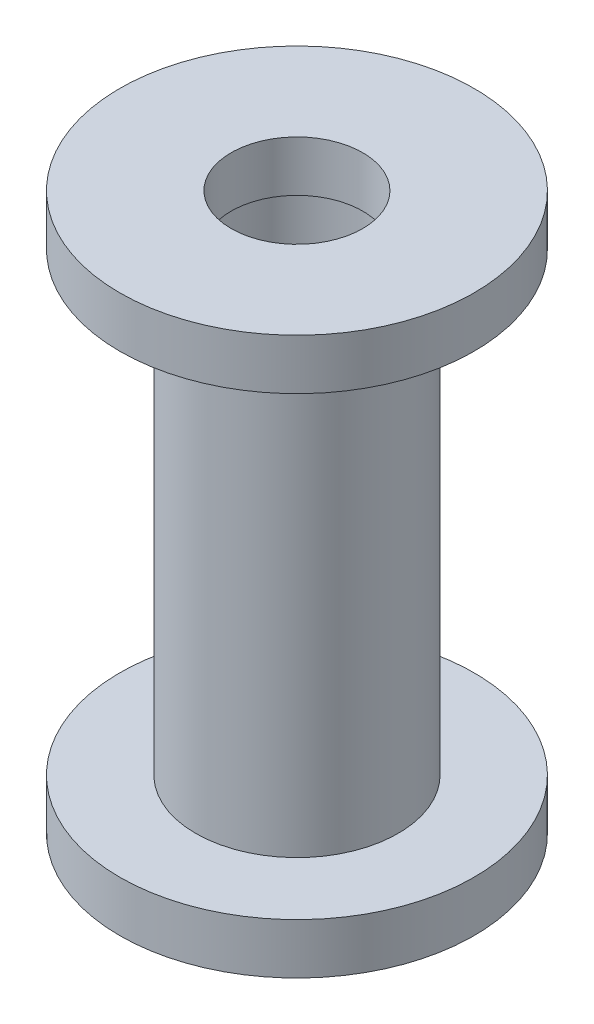
ISO-10303-21;
HEADER;
FILE_DESCRIPTION(('STEP AP214'),'2;1');
FILE_NAME('part.step','',(''),(''),'','','');
FILE_SCHEMA(('AUTOMOTIVE_DESIGN { 1 0 10303 214 1 1 1 1 }'));
ENDSEC;
DATA;
#1=APPLICATION_CONTEXT('core data for automotive mechanical design processes');
#2=APPLICATION_PROTOCOL_DEFINITION('international standard','automotive_design',2000,#1);
#3=PRODUCT_CONTEXT('',#1,'mechanical');
#4=PRODUCT('Part','Part','',(#3));
#5=PRODUCT_RELATED_PRODUCT_CATEGORY('part','',(#4));
#6=PRODUCT_DEFINITION_FORMATION('','',#4);
#7=PRODUCT_DEFINITION_CONTEXT('part definition',#1,'design');
#8=PRODUCT_DEFINITION('design','',#6,#7);
#9=PRODUCT_DEFINITION_SHAPE('','',#8);
#10=(LENGTH_UNIT() NAMED_UNIT(*) SI_UNIT(.MILLI.,.METRE.));
#11=(NAMED_UNIT(*) PLANE_ANGLE_UNIT() SI_UNIT($,.RADIAN.));
#12=(NAMED_UNIT(*) SI_UNIT($,.STERADIAN.) SOLID_ANGLE_UNIT());
#13=UNCERTAINTY_MEASURE_WITH_UNIT(LENGTH_MEASURE(1.E-05),#10,'distance_accuracy_value','');
#14=(GEOMETRIC_REPRESENTATION_CONTEXT(3) GLOBAL_UNCERTAINTY_ASSIGNED_CONTEXT((#13)) GLOBAL_UNIT_ASSIGNED_CONTEXT((#10,
#11,#12)) REPRESENTATION_CONTEXT('',''));
#15=CARTESIAN_POINT('',(0.,0.,0.));
#16=DIRECTION('',(0.,0.,1.));
#17=DIRECTION('',(1.,0.,0.));
#18=AXIS2_PLACEMENT_3D('',#15,#16,#17);
#19=CARTESIAN_POINT('',(0.,2.,0.));
#20=DIRECTION('',(0.,-1.,0.));
#21=DIRECTION('',(0.,0.,-1.));
#22=AXIS2_PLACEMENT_3D('',#19,#20,#21);
#23=CYLINDRICAL_SURFACE('',#22,7.);
#24=CARTESIAN_POINT('',(0.,2.,0.));
#25=DIRECTION('',(0.,1.,0.));
#26=DIRECTION('',(0.,0.,1.));
#27=AXIS2_PLACEMENT_3D('',#24,#25,#26);
#28=CIRCLE('',#27,7.);
#29=CARTESIAN_POINT('',(0.,2.,7.));
#30=VERTEX_POINT('',#29);
#31=EDGE_CURVE('E48',#30,#30,#28,.T.);
#32=ORIENTED_EDGE('',*,*,#31,.F.);
#33=EDGE_LOOP('',(#32));
#34=FACE_BOUND('',#33,.T.);
#35=CARTESIAN_POINT('',(0.,0.,0.));
#36=DIRECTION('',(0.,1.,0.));
#37=DIRECTION('',(0.,0.,1.));
#38=AXIS2_PLACEMENT_3D('',#35,#36,#37);
#39=CIRCLE('',#38,7.);
#40=CARTESIAN_POINT('',(0.,0.,7.));
#41=VERTEX_POINT('',#40);
#42=EDGE_CURVE('E42',#41,#41,#39,.T.);
#43=ORIENTED_EDGE('',*,*,#42,.T.);
#44=EDGE_LOOP('',(#43));
#45=FACE_BOUND('',#44,.T.);
#46=ADVANCED_FACE('F41',(#34,#45),#23,.T.);
#47=CARTESIAN_POINT('',(0.,2.,0.));
#48=DIRECTION('',(0.,1.,0.));
#49=DIRECTION('',(0.,0.,1.));
#50=AXIS2_PLACEMENT_3D('',#47,#48,#49);
#51=PLANE('',#50);
#52=CARTESIAN_POINT('',(0.,2.,0.));
#53=DIRECTION('',(0.,1.,0.));
#54=DIRECTION('',(0.,0.,1.));
#55=AXIS2_PLACEMENT_3D('',#52,#53,#54);
#56=CIRCLE('',#55,4.);
#57=CARTESIAN_POINT('',(0.,2.,4.));
#58=VERTEX_POINT('',#57);
#59=EDGE_CURVE('E10',#58,#58,#56,.T.);
#60=ORIENTED_EDGE('',*,*,#59,.F.);
#61=EDGE_LOOP('',(#60));
#62=FACE_BOUND('',#61,.T.);
#63=ORIENTED_EDGE('',*,*,#31,.T.);
#64=EDGE_LOOP('',(#63));
#65=FACE_BOUND('',#64,.T.);
#66=ADVANCED_FACE('F109',(#62,#65),#51,.T.);
#67=CARTESIAN_POINT('',(0.,0.,0.));
#68=DIRECTION('',(0.,1.,0.));
#69=DIRECTION('',(0.,0.,1.));
#70=AXIS2_PLACEMENT_3D('',#67,#68,#69);
#71=PLANE('',#70);
#72=CARTESIAN_POINT('',(0.,0.,0.));
#73=DIRECTION('',(0.,1.,0.));
#74=DIRECTION('',(0.,0.,1.));
#75=AXIS2_PLACEMENT_3D('',#72,#73,#74);
#76=CIRCLE('',#75,2.75);
#77=CARTESIAN_POINT('',(0.,0.,2.75));
#78=VERTEX_POINT('',#77);
#79=EDGE_CURVE('E60',#78,#78,#76,.T.);
#80=ORIENTED_EDGE('',*,*,#79,.T.);
#81=EDGE_LOOP('',(#80));
#82=FACE_BOUND('',#81,.T.);
#83=ORIENTED_EDGE('',*,*,#42,.F.);
#84=EDGE_LOOP('',(#83));
#85=FACE_BOUND('',#84,.T.);
#86=ADVANCED_FACE('F113',(#82,#85),#71,.F.);
#87=CARTESIAN_POINT('',(0.,20.,0.));
#88=DIRECTION('',(0.,-1.,0.));
#89=DIRECTION('',(0.,0.,-1.));
#90=AXIS2_PLACEMENT_3D('',#87,#88,#89);
#91=CYLINDRICAL_SURFACE('',#90,4.);
#92=CARTESIAN_POINT('',(0.,20.,0.));
#93=DIRECTION('',(0.,1.,0.));
#94=DIRECTION('',(0.,0.,1.));
#95=AXIS2_PLACEMENT_3D('',#92,#93,#94);
#96=CIRCLE('',#95,4.);
#97=CARTESIAN_POINT('',(0.,20.,4.));
#98=VERTEX_POINT('',#97);
#99=EDGE_CURVE('E53',#98,#98,#96,.T.);
#100=ORIENTED_EDGE('',*,*,#99,.F.);
#101=EDGE_LOOP('',(#100));
#102=FACE_BOUND('',#101,.T.);
#103=ORIENTED_EDGE('',*,*,#59,.T.);
#104=EDGE_LOOP('',(#103));
#105=FACE_BOUND('',#104,.T.);
#106=ADVANCED_FACE('F104',(#102,#105),#91,.T.);
#107=CARTESIAN_POINT('',(0.,0.,0.));
#108=DIRECTION('',(0.,1.,0.));
#109=DIRECTION('',(0.,0.,1.));
#110=AXIS2_PLACEMENT_3D('',#107,#108,#109);
#111=CYLINDRICAL_SURFACE('',#110,2.75);
#112=ORIENTED_EDGE('',*,*,#79,.F.);
#113=EDGE_LOOP('',(#112));
#114=FACE_BOUND('',#113,.T.);
#115=CARTESIAN_POINT('',(0.,20.,0.));
#116=DIRECTION('',(0.,1.,0.));
#117=DIRECTION('',(0.,0.,1.));
#118=AXIS2_PLACEMENT_3D('',#115,#116,#117);
#119=CIRCLE('',#118,2.75);
#120=CARTESIAN_POINT('',(0.,20.,2.75));
#121=VERTEX_POINT('',#120);
#122=EDGE_CURVE('E59',#121,#121,#119,.T.);
#123=ORIENTED_EDGE('',*,*,#122,.T.);
#124=EDGE_LOOP('',(#123));
#125=FACE_BOUND('',#124,.T.);
#126=ADVANCED_FACE('F97',(#114,#125),#111,.F.);
#127=CARTESIAN_POINT('',(0.,20.,0.));
#128=DIRECTION('',(0.,1.,0.));
#129=DIRECTION('',(0.,0.,1.));
#130=AXIS2_PLACEMENT_3D('',#127,#128,#129);
#131=PLANE('',#130);
#132=ORIENTED_EDGE('',*,*,#99,.T.);
#133=EDGE_LOOP('',(#132));
#134=FACE_BOUND('',#133,.T.);
#135=CARTESIAN_POINT('',(0.,20.,0.));
#136=DIRECTION('',(0.,1.,0.));
#137=DIRECTION('',(0.,0.,1.));
#138=AXIS2_PLACEMENT_3D('',#135,#136,#137);
#139=CIRCLE('',#138,7.);
#140=CARTESIAN_POINT('',(0.,20.,7.));
#141=VERTEX_POINT('',#140);
#142=EDGE_CURVE('E62',#141,#141,#139,.T.);
#143=ORIENTED_EDGE('',*,*,#142,.F.);
#144=EDGE_LOOP('',(#143));
#145=FACE_BOUND('',#144,.T.);
#146=ADVANCED_FACE('F90',(#134,#145),#131,.F.);
#147=CARTESIAN_POINT('',(0.,22.,0.));
#148=DIRECTION('',(0.,1.,0.));
#149=DIRECTION('',(0.,0.,1.));
#150=AXIS2_PLACEMENT_3D('',#147,#148,#149);
#151=PLANE('',#150);
#152=CARTESIAN_POINT('',(0.,22.,0.));
#153=DIRECTION('',(0.,1.,0.));
#154=DIRECTION('',(0.,0.,1.));
#155=AXIS2_PLACEMENT_3D('',#152,#153,#154);
#156=CIRCLE('',#155,2.6);
#157=CARTESIAN_POINT('',(0.,22.,2.6));
#158=VERTEX_POINT('',#157);
#159=EDGE_CURVE('E66',#158,#158,#156,.T.);
#160=ORIENTED_EDGE('',*,*,#159,.F.);
#161=EDGE_LOOP('',(#160));
#162=FACE_BOUND('',#161,.T.);
#163=CARTESIAN_POINT('',(0.,22.,0.));
#164=DIRECTION('',(0.,1.,0.));
#165=DIRECTION('',(0.,0.,1.));
#166=AXIS2_PLACEMENT_3D('',#163,#164,#165);
#167=CIRCLE('',#166,7.);
#168=CARTESIAN_POINT('',(0.,22.,7.));
#169=VERTEX_POINT('',#168);
#170=EDGE_CURVE('E63',#169,#169,#167,.T.);
#171=ORIENTED_EDGE('',*,*,#170,.T.);
#172=EDGE_LOOP('',(#171));
#173=FACE_BOUND('',#172,.T.);
#174=ADVANCED_FACE('F81',(#162,#173),#151,.T.);
#175=CARTESIAN_POINT('',(0.,22.,0.));
#176=DIRECTION('',(0.,-1.,0.));
#177=DIRECTION('',(0.,0.,-1.));
#178=AXIS2_PLACEMENT_3D('',#175,#176,#177);
#179=CYLINDRICAL_SURFACE('',#178,7.);
#180=ORIENTED_EDGE('',*,*,#170,.F.);
#181=EDGE_LOOP('',(#180));
#182=FACE_BOUND('',#181,.T.);
#183=ORIENTED_EDGE('',*,*,#142,.T.);
#184=EDGE_LOOP('',(#183));
#185=FACE_BOUND('',#184,.T.);
#186=ADVANCED_FACE('F86',(#182,#185),#179,.T.);
#187=CARTESIAN_POINT('',(0.,20.,0.));
#188=DIRECTION('',(0.,1.,0.));
#189=DIRECTION('',(0.,0.,1.));
#190=AXIS2_PLACEMENT_3D('',#187,#188,#189);
#191=CIRCLE('',#190,2.6);
#192=CARTESIAN_POINT('',(0.,20.,2.6));
#193=VERTEX_POINT('',#192);
#194=EDGE_CURVE('E69',#193,#193,#191,.T.);
#195=ORIENTED_EDGE('',*,*,#194,.T.);
#196=EDGE_LOOP('',(#195));
#197=FACE_BOUND('',#196,.T.);
#198=ORIENTED_EDGE('',*,*,#122,.F.);
#199=EDGE_LOOP('',(#198));
#200=FACE_BOUND('',#199,.T.);
#201=ADVANCED_FACE('F78',(#197,#200),#131,.F.);
#202=CARTESIAN_POINT('',(0.,20.,0.));
#203=DIRECTION('',(0.,1.,0.));
#204=DIRECTION('',(0.,0.,1.));
#205=AXIS2_PLACEMENT_3D('',#202,#203,#204);
#206=CYLINDRICAL_SURFACE('',#205,2.6);
#207=ORIENTED_EDGE('',*,*,#194,.F.);
#208=EDGE_LOOP('',(#207));
#209=FACE_BOUND('',#208,.T.);
#210=ORIENTED_EDGE('',*,*,#159,.T.);
#211=EDGE_LOOP('',(#210));
#212=FACE_BOUND('',#211,.T.);
#213=ADVANCED_FACE('F77',(#209,#212),#206,.F.);
#214=CLOSED_SHELL('',(#46,#66,#86,#106,#126,#146,#174,#186,#201,#213));
#215=MANIFOLD_SOLID_BREP('B2',#214);
#216=ADVANCED_BREP_SHAPE_REPRESENTATION('',(#18,#215),#14);
#217=SHAPE_DEFINITION_REPRESENTATION(#9,#216);
ENDSEC;
END-ISO-10303-21;
